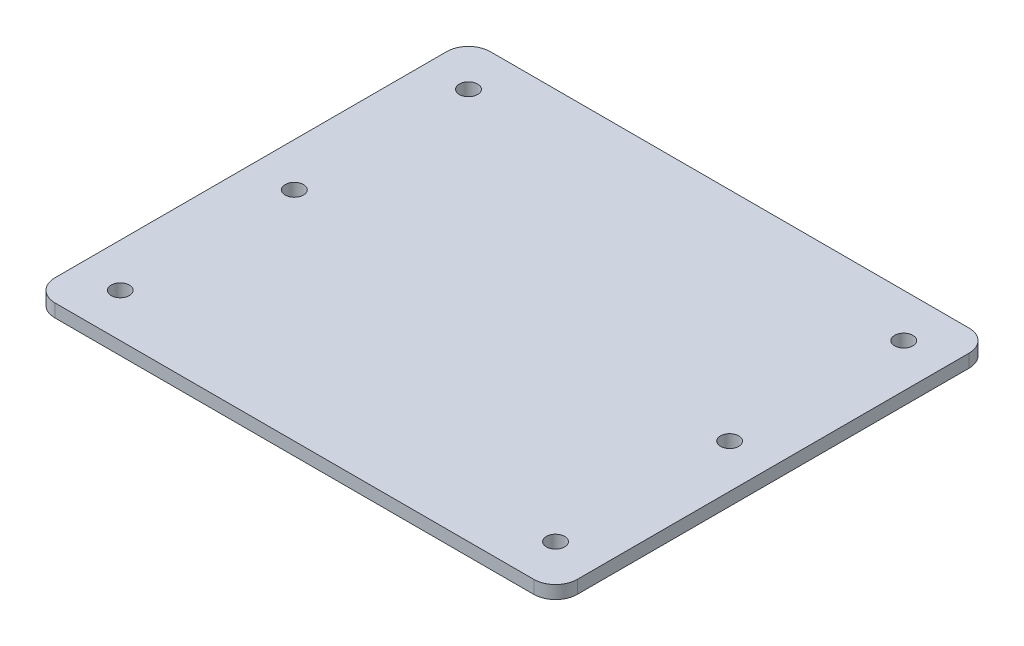
ISO-10303-21;
HEADER;
FILE_DESCRIPTION(('STEP AP214'),'2;1');
FILE_NAME('part.step','',(''),(''),'','','');
FILE_SCHEMA(('AUTOMOTIVE_DESIGN { 1 0 10303 214 1 1 1 1 }'));
ENDSEC;
DATA;
#1=APPLICATION_CONTEXT('core data for automotive mechanical design processes');
#2=APPLICATION_PROTOCOL_DEFINITION('international standard','automotive_design',2000,#1);
#3=PRODUCT_CONTEXT('',#1,'mechanical');
#4=PRODUCT('Part','Part','',(#3));
#5=PRODUCT_RELATED_PRODUCT_CATEGORY('part','',(#4));
#6=PRODUCT_DEFINITION_FORMATION('','',#4);
#7=PRODUCT_DEFINITION_CONTEXT('part definition',#1,'design');
#8=PRODUCT_DEFINITION('design','',#6,#7);
#9=PRODUCT_DEFINITION_SHAPE('','',#8);
#10=(LENGTH_UNIT() NAMED_UNIT(*) SI_UNIT(.MILLI.,.METRE.));
#11=(NAMED_UNIT(*) PLANE_ANGLE_UNIT() SI_UNIT($,.RADIAN.));
#12=(NAMED_UNIT(*) SI_UNIT($,.STERADIAN.) SOLID_ANGLE_UNIT());
#13=UNCERTAINTY_MEASURE_WITH_UNIT(LENGTH_MEASURE(1.E-05),#10,'distance_accuracy_value','');
#14=(GEOMETRIC_REPRESENTATION_CONTEXT(3) GLOBAL_UNCERTAINTY_ASSIGNED_CONTEXT((#13)) GLOBAL_UNIT_ASSIGNED_CONTEXT((#10,
#11,#12)) REPRESENTATION_CONTEXT('',''));
#15=CARTESIAN_POINT('',(0.,0.,0.));
#16=DIRECTION('',(0.,0.,1.));
#17=DIRECTION('',(1.,0.,0.));
#18=AXIS2_PLACEMENT_3D('',#15,#16,#17);
#19=CARTESIAN_POINT('',(50.,0.,40.));
#20=DIRECTION('',(0.,1.,0.));
#21=DIRECTION('',(0.,0.,1.));
#22=AXIS2_PLACEMENT_3D('',#19,#20,#21);
#23=CYLINDRICAL_SURFACE('',#22,2.1);
#24=CARTESIAN_POINT('',(50.,0.,40.));
#25=DIRECTION('',(0.,1.,0.));
#26=DIRECTION('',(0.,0.,1.));
#27=AXIS2_PLACEMENT_3D('',#24,#25,#26);
#28=CIRCLE('',#27,2.1);
#29=CARTESIAN_POINT('',(50.,0.,42.1));
#30=VERTEX_POINT('',#29);
#31=EDGE_CURVE('E42',#30,#30,#28,.T.);
#32=ORIENTED_EDGE('',*,*,#31,.F.);
#33=EDGE_LOOP('',(#32));
#34=FACE_BOUND('',#33,.T.);
#35=CARTESIAN_POINT('',(50.,3.,40.));
#36=DIRECTION('',(0.,1.,0.));
#37=DIRECTION('',(0.,0.,1.));
#38=AXIS2_PLACEMENT_3D('',#35,#36,#37);
#39=CIRCLE('',#38,2.1);
#40=CARTESIAN_POINT('',(50.,3.,42.1));
#41=VERTEX_POINT('',#40);
#42=EDGE_CURVE('E11',#41,#41,#39,.T.);
#43=ORIENTED_EDGE('',*,*,#42,.T.);
#44=EDGE_LOOP('',(#43));
#45=FACE_BOUND('',#44,.T.);
#46=ADVANCED_FACE('F35',(#34,#45),#23,.F.);
#47=CARTESIAN_POINT('',(60.,3.,-50.));
#48=DIRECTION('',(-1.,0.,0.));
#49=DIRECTION('',(0.,0.,1.));
#50=AXIS2_PLACEMENT_3D('',#47,#48,#49);
#51=PLANE('',#50);
#52=DIRECTION('',(0.,0.,-1.));
#53=VECTOR('',#52,1.);
#54=CARTESIAN_POINT('',(60.,3.,-50.));
#55=LINE('',#54,#53);
#56=CARTESIAN_POINT('',(60.,3.,45.));
#57=VERTEX_POINT('',#56);
#58=CARTESIAN_POINT('',(60.,3.,-45.));
#59=VERTEX_POINT('',#58);
#60=EDGE_CURVE('E128',#57,#59,#55,.T.);
#61=ORIENTED_EDGE('',*,*,#60,.F.);
#62=DIRECTION('',(0.,-1.,0.));
#63=VECTOR('',#62,1.);
#64=CARTESIAN_POINT('',(60.,3.,45.));
#65=LINE('',#64,#63);
#66=CARTESIAN_POINT('',(60.,0.,45.));
#67=VERTEX_POINT('',#66);
#68=EDGE_CURVE('E154',#57,#67,#65,.T.);
#69=ORIENTED_EDGE('',*,*,#68,.T.);
#70=DIRECTION('',(0.,0.,-1.));
#71=VECTOR('',#70,1.);
#72=CARTESIAN_POINT('',(60.,0.,-50.));
#73=LINE('',#72,#71);
#74=CARTESIAN_POINT('',(60.,0.,-45.));
#75=VERTEX_POINT('',#74);
#76=EDGE_CURVE('E221',#67,#75,#73,.T.);
#77=ORIENTED_EDGE('',*,*,#76,.T.);
#78=DIRECTION('',(0.,-1.,0.));
#79=VECTOR('',#78,1.);
#80=CARTESIAN_POINT('',(60.,3.,-45.));
#81=LINE('',#80,#79);
#82=EDGE_CURVE('E152',#75,#59,#81,.F.);
#83=ORIENTED_EDGE('',*,*,#82,.T.);
#84=EDGE_LOOP('',(#61,#69,#77,#83));
#85=FACE_BOUND('',#84,.T.);
#86=ADVANCED_FACE('F165',(#85),#51,.F.);
#87=CARTESIAN_POINT('',(-60.,3.,-50.));
#88=DIRECTION('',(0.,0.,1.));
#89=DIRECTION('',(1.,0.,0.));
#90=AXIS2_PLACEMENT_3D('',#87,#88,#89);
#91=PLANE('',#90);
#92=DIRECTION('',(-1.,0.,0.));
#93=VECTOR('',#92,1.);
#94=CARTESIAN_POINT('',(-60.,3.,-50.));
#95=LINE('',#94,#93);
#96=CARTESIAN_POINT('',(55.,3.,-50.));
#97=VERTEX_POINT('',#96);
#98=CARTESIAN_POINT('',(-55.,3.,-50.));
#99=VERTEX_POINT('',#98);
#100=EDGE_CURVE('E131',#97,#99,#95,.T.);
#101=ORIENTED_EDGE('',*,*,#100,.F.);
#102=DIRECTION('',(0.,-1.,0.));
#103=VECTOR('',#102,1.);
#104=CARTESIAN_POINT('',(55.,3.,-50.));
#105=LINE('',#104,#103);
#106=CARTESIAN_POINT('',(55.,0.,-50.));
#107=VERTEX_POINT('',#106);
#108=EDGE_CURVE('E158',#97,#107,#105,.T.);
#109=ORIENTED_EDGE('',*,*,#108,.T.);
#110=DIRECTION('',(-1.,0.,0.));
#111=VECTOR('',#110,1.);
#112=CARTESIAN_POINT('',(-60.,0.,-50.));
#113=LINE('',#112,#111);
#114=CARTESIAN_POINT('',(-55.,0.,-50.));
#115=VERTEX_POINT('',#114);
#116=EDGE_CURVE('E133',#107,#115,#113,.T.);
#117=ORIENTED_EDGE('',*,*,#116,.T.);
#118=DIRECTION('',(0.,-1.,0.));
#119=VECTOR('',#118,1.);
#120=CARTESIAN_POINT('',(-55.,3.,-50.));
#121=LINE('',#120,#119);
#122=EDGE_CURVE('E49',#115,#99,#121,.F.);
#123=ORIENTED_EDGE('',*,*,#122,.T.);
#124=EDGE_LOOP('',(#101,#109,#117,#123));
#125=FACE_BOUND('',#124,.T.);
#126=ADVANCED_FACE('F188',(#125),#91,.F.);
#127=CARTESIAN_POINT('',(-60.,3.,-50.));
#128=DIRECTION('',(1.,0.,0.));
#129=DIRECTION('',(0.,0.,-1.));
#130=AXIS2_PLACEMENT_3D('',#127,#128,#129);
#131=PLANE('',#130);
#132=DIRECTION('',(0.,0.,1.));
#133=VECTOR('',#132,1.);
#134=CARTESIAN_POINT('',(-60.,0.,-50.));
#135=LINE('',#134,#133);
#136=CARTESIAN_POINT('',(-60.,0.,-45.));
#137=VERTEX_POINT('',#136);
#138=CARTESIAN_POINT('',(-60.,0.,45.));
#139=VERTEX_POINT('',#138);
#140=EDGE_CURVE('E129',#137,#139,#135,.T.);
#141=ORIENTED_EDGE('',*,*,#140,.T.);
#142=DIRECTION('',(0.,-1.,0.));
#143=VECTOR('',#142,1.);
#144=CARTESIAN_POINT('',(-60.,3.,45.));
#145=LINE('',#144,#143);
#146=CARTESIAN_POINT('',(-60.,3.,45.));
#147=VERTEX_POINT('',#146);
#148=EDGE_CURVE('E106',#139,#147,#145,.F.);
#149=ORIENTED_EDGE('',*,*,#148,.T.);
#150=DIRECTION('',(0.,0.,1.));
#151=VECTOR('',#150,1.);
#152=CARTESIAN_POINT('',(-60.,3.,-50.));
#153=LINE('',#152,#151);
#154=CARTESIAN_POINT('',(-60.,3.,-45.));
#155=VERTEX_POINT('',#154);
#156=EDGE_CURVE('E216',#155,#147,#153,.T.);
#157=ORIENTED_EDGE('',*,*,#156,.F.);
#158=DIRECTION('',(0.,-1.,0.));
#159=VECTOR('',#158,1.);
#160=CARTESIAN_POINT('',(-60.,3.,-45.));
#161=LINE('',#160,#159);
#162=EDGE_CURVE('E111',#155,#137,#161,.T.);
#163=ORIENTED_EDGE('',*,*,#162,.T.);
#164=EDGE_LOOP('',(#141,#149,#157,#163));
#165=FACE_BOUND('',#164,.T.);
#166=ADVANCED_FACE('F178',(#165),#131,.F.);
#167=CARTESIAN_POINT('',(-60.,3.,50.));
#168=DIRECTION('',(0.,0.,-1.));
#169=DIRECTION('',(-1.,0.,0.));
#170=AXIS2_PLACEMENT_3D('',#167,#168,#169);
#171=PLANE('',#170);
#172=DIRECTION('',(1.,0.,0.));
#173=VECTOR('',#172,1.);
#174=CARTESIAN_POINT('',(-60.,3.,50.));
#175=LINE('',#174,#173);
#176=CARTESIAN_POINT('',(-55.,3.,50.));
#177=VERTEX_POINT('',#176);
#178=CARTESIAN_POINT('',(55.,3.,50.));
#179=VERTEX_POINT('',#178);
#180=EDGE_CURVE('E121',#177,#179,#175,.T.);
#181=ORIENTED_EDGE('',*,*,#180,.F.);
#182=DIRECTION('',(0.,-1.,0.));
#183=VECTOR('',#182,1.);
#184=CARTESIAN_POINT('',(-55.,3.,50.));
#185=LINE('',#184,#183);
#186=CARTESIAN_POINT('',(-55.,0.,50.));
#187=VERTEX_POINT('',#186);
#188=EDGE_CURVE('E105',#177,#187,#185,.T.);
#189=ORIENTED_EDGE('',*,*,#188,.T.);
#190=DIRECTION('',(1.,0.,0.));
#191=VECTOR('',#190,1.);
#192=CARTESIAN_POINT('',(-60.,0.,50.));
#193=LINE('',#192,#191);
#194=CARTESIAN_POINT('',(55.,0.,50.));
#195=VERTEX_POINT('',#194);
#196=EDGE_CURVE('E118',#187,#195,#193,.T.);
#197=ORIENTED_EDGE('',*,*,#196,.T.);
#198=DIRECTION('',(0.,-1.,0.));
#199=VECTOR('',#198,1.);
#200=CARTESIAN_POINT('',(55.,3.,50.));
#201=LINE('',#200,#199);
#202=EDGE_CURVE('E123',#195,#179,#201,.F.);
#203=ORIENTED_EDGE('',*,*,#202,.T.);
#204=EDGE_LOOP('',(#181,#189,#197,#203));
#205=FACE_BOUND('',#204,.T.);
#206=ADVANCED_FACE('F117',(#205),#171,.F.);
#207=CARTESIAN_POINT('',(0.,3.,0.));
#208=DIRECTION('',(0.,1.,0.));
#209=DIRECTION('',(0.,0.,1.));
#210=AXIS2_PLACEMENT_3D('',#207,#208,#209);
#211=PLANE('',#210);
#212=CARTESIAN_POINT('',(-50.,3.,-40.));
#213=DIRECTION('',(0.,-1.,0.));
#214=DIRECTION('',(0.,0.,1.));
#215=AXIS2_PLACEMENT_3D('',#212,#213,#214);
#216=CIRCLE('',#215,2.1);
#217=CARTESIAN_POINT('',(-50.,3.,-37.9));
#218=VERTEX_POINT('',#217);
#219=EDGE_CURVE('E257',#218,#218,#216,.T.);
#220=ORIENTED_EDGE('',*,*,#219,.T.);
#221=EDGE_LOOP('',(#220));
#222=FACE_BOUND('',#221,.T.);
#223=CARTESIAN_POINT('',(-50.,3.,0.));
#224=DIRECTION('',(0.,-1.,0.));
#225=DIRECTION('',(0.,0.,1.));
#226=AXIS2_PLACEMENT_3D('',#223,#224,#225);
#227=CIRCLE('',#226,2.1);
#228=CARTESIAN_POINT('',(-50.,3.,2.10000000000001));
#229=VERTEX_POINT('',#228);
#230=EDGE_CURVE('E251',#229,#229,#227,.T.);
#231=ORIENTED_EDGE('',*,*,#230,.T.);
#232=EDGE_LOOP('',(#231));
#233=FACE_BOUND('',#232,.T.);
#234=CARTESIAN_POINT('',(-50.,3.,40.));
#235=DIRECTION('',(0.,-1.,0.));
#236=DIRECTION('',(0.,0.,1.));
#237=AXIS2_PLACEMENT_3D('',#234,#235,#236);
#238=CIRCLE('',#237,2.1);
#239=CARTESIAN_POINT('',(-50.,3.,42.1));
#240=VERTEX_POINT('',#239);
#241=EDGE_CURVE('E245',#240,#240,#238,.T.);
#242=ORIENTED_EDGE('',*,*,#241,.T.);
#243=EDGE_LOOP('',(#242));
#244=FACE_BOUND('',#243,.T.);
#245=CARTESIAN_POINT('',(50.,3.,0.));
#246=DIRECTION('',(0.,1.,0.));
#247=DIRECTION('',(0.,0.,1.));
#248=AXIS2_PLACEMENT_3D('',#245,#246,#247);
#249=CIRCLE('',#248,2.1);
#250=CARTESIAN_POINT('',(50.,3.,2.1));
#251=VERTEX_POINT('',#250);
#252=EDGE_CURVE('E236',#251,#251,#249,.T.);
#253=ORIENTED_EDGE('',*,*,#252,.F.);
#254=EDGE_LOOP('',(#253));
#255=FACE_BOUND('',#254,.T.);
#256=CARTESIAN_POINT('',(50.,3.,-40.));
#257=DIRECTION('',(0.,1.,0.));
#258=DIRECTION('',(0.,0.,1.));
#259=AXIS2_PLACEMENT_3D('',#256,#257,#258);
#260=CIRCLE('',#259,2.1);
#261=CARTESIAN_POINT('',(50.,3.,-37.9));
#262=VERTEX_POINT('',#261);
#263=EDGE_CURVE('E231',#262,#262,#260,.T.);
#264=ORIENTED_EDGE('',*,*,#263,.F.);
#265=EDGE_LOOP('',(#264));
#266=FACE_BOUND('',#265,.T.);
#267=ORIENTED_EDGE('',*,*,#156,.T.);
#268=CARTESIAN_POINT('',(-55.,3.,45.));
#269=DIRECTION('',(0.,1.,0.));
#270=DIRECTION('',(0.,0.,1.));
#271=AXIS2_PLACEMENT_3D('',#268,#269,#270);
#272=CIRCLE('',#271,5.);
#273=EDGE_CURVE('E150',#147,#177,#272,.T.);
#274=ORIENTED_EDGE('',*,*,#273,.T.);
#275=ORIENTED_EDGE('',*,*,#180,.T.);
#276=CARTESIAN_POINT('',(55.,3.,45.));
#277=DIRECTION('',(0.,1.,0.));
#278=DIRECTION('',(0.,0.,1.));
#279=AXIS2_PLACEMENT_3D('',#276,#277,#278);
#280=CIRCLE('',#279,5.);
#281=EDGE_CURVE('E148',#179,#57,#280,.T.);
#282=ORIENTED_EDGE('',*,*,#281,.T.);
#283=ORIENTED_EDGE('',*,*,#60,.T.);
#284=CARTESIAN_POINT('',(55.,3.,-45.));
#285=DIRECTION('',(0.,1.,0.));
#286=DIRECTION('',(0.,0.,1.));
#287=AXIS2_PLACEMENT_3D('',#284,#285,#286);
#288=CIRCLE('',#287,5.);
#289=EDGE_CURVE('E56',#59,#97,#288,.T.);
#290=ORIENTED_EDGE('',*,*,#289,.T.);
#291=ORIENTED_EDGE('',*,*,#100,.T.);
#292=CARTESIAN_POINT('',(-55.,3.,-45.));
#293=DIRECTION('',(0.,1.,0.));
#294=DIRECTION('',(0.,0.,1.));
#295=AXIS2_PLACEMENT_3D('',#292,#293,#294);
#296=CIRCLE('',#295,5.);
#297=EDGE_CURVE('E145',#99,#155,#296,.T.);
#298=ORIENTED_EDGE('',*,*,#297,.T.);
#299=EDGE_LOOP('',(#267,#274,#275,#282,#283,#290,#291,#298));
#300=FACE_BOUND('',#299,.T.);
#301=ORIENTED_EDGE('',*,*,#42,.F.);
#302=EDGE_LOOP('',(#301));
#303=FACE_BOUND('',#302,.T.);
#304=ADVANCED_FACE('F168',(#222,#233,#244,#255,#266,#300,#303),#211,.T.);
#305=CARTESIAN_POINT('',(0.,0.,0.));
#306=DIRECTION('',(0.,1.,0.));
#307=DIRECTION('',(0.,0.,1.));
#308=AXIS2_PLACEMENT_3D('',#305,#306,#307);
#309=PLANE('',#308);
#310=CARTESIAN_POINT('',(-50.,0.,-40.));
#311=DIRECTION('',(0.,-1.,0.));
#312=DIRECTION('',(0.,0.,1.));
#313=AXIS2_PLACEMENT_3D('',#310,#311,#312);
#314=CIRCLE('',#313,2.1);
#315=CARTESIAN_POINT('',(-50.,0.,-37.9));
#316=VERTEX_POINT('',#315);
#317=EDGE_CURVE('E244',#316,#316,#314,.T.);
#318=ORIENTED_EDGE('',*,*,#317,.F.);
#319=EDGE_LOOP('',(#318));
#320=FACE_BOUND('',#319,.T.);
#321=CARTESIAN_POINT('',(-50.,0.,0.));
#322=DIRECTION('',(0.,-1.,0.));
#323=DIRECTION('',(0.,0.,1.));
#324=AXIS2_PLACEMENT_3D('',#321,#322,#323);
#325=CIRCLE('',#324,2.1);
#326=CARTESIAN_POINT('',(-50.,0.,2.10000000000001));
#327=VERTEX_POINT('',#326);
#328=EDGE_CURVE('E254',#327,#327,#325,.T.);
#329=ORIENTED_EDGE('',*,*,#328,.F.);
#330=EDGE_LOOP('',(#329));
#331=FACE_BOUND('',#330,.T.);
#332=CARTESIAN_POINT('',(-50.,0.,40.));
#333=DIRECTION('',(0.,-1.,0.));
#334=DIRECTION('',(0.,0.,1.));
#335=AXIS2_PLACEMENT_3D('',#332,#333,#334);
#336=CIRCLE('',#335,2.1);
#337=CARTESIAN_POINT('',(-50.,0.,42.1));
#338=VERTEX_POINT('',#337);
#339=EDGE_CURVE('E248',#338,#338,#336,.T.);
#340=ORIENTED_EDGE('',*,*,#339,.F.);
#341=EDGE_LOOP('',(#340));
#342=FACE_BOUND('',#341,.T.);
#343=CARTESIAN_POINT('',(50.,0.,0.));
#344=DIRECTION('',(0.,1.,0.));
#345=DIRECTION('',(0.,0.,1.));
#346=AXIS2_PLACEMENT_3D('',#343,#344,#345);
#347=CIRCLE('',#346,2.1);
#348=CARTESIAN_POINT('',(50.,0.,2.1));
#349=VERTEX_POINT('',#348);
#350=EDGE_CURVE('E241',#349,#349,#347,.T.);
#351=ORIENTED_EDGE('',*,*,#350,.T.);
#352=EDGE_LOOP('',(#351));
#353=FACE_BOUND('',#352,.T.);
#354=CARTESIAN_POINT('',(50.,0.,-40.));
#355=DIRECTION('',(0.,1.,0.));
#356=DIRECTION('',(0.,0.,1.));
#357=AXIS2_PLACEMENT_3D('',#354,#355,#356);
#358=CIRCLE('',#357,2.1);
#359=CARTESIAN_POINT('',(50.,0.,-37.9));
#360=VERTEX_POINT('',#359);
#361=EDGE_CURVE('E223',#360,#360,#358,.T.);
#362=ORIENTED_EDGE('',*,*,#361,.T.);
#363=EDGE_LOOP('',(#362));
#364=FACE_BOUND('',#363,.T.);
#365=ORIENTED_EDGE('',*,*,#196,.F.);
#366=CARTESIAN_POINT('',(-55.,0.,45.));
#367=DIRECTION('',(0.,1.,0.));
#368=DIRECTION('',(0.,0.,1.));
#369=AXIS2_PLACEMENT_3D('',#366,#367,#368);
#370=CIRCLE('',#369,5.);
#371=EDGE_CURVE('E101',#187,#139,#370,.F.);
#372=ORIENTED_EDGE('',*,*,#371,.T.);
#373=ORIENTED_EDGE('',*,*,#140,.F.);
#374=CARTESIAN_POINT('',(-55.,0.,-45.));
#375=DIRECTION('',(0.,1.,0.));
#376=DIRECTION('',(0.,0.,1.));
#377=AXIS2_PLACEMENT_3D('',#374,#375,#376);
#378=CIRCLE('',#377,5.);
#379=EDGE_CURVE('E122',#137,#115,#378,.F.);
#380=ORIENTED_EDGE('',*,*,#379,.T.);
#381=ORIENTED_EDGE('',*,*,#116,.F.);
#382=CARTESIAN_POINT('',(55.,0.,-45.));
#383=DIRECTION('',(0.,1.,0.));
#384=DIRECTION('',(0.,0.,1.));
#385=AXIS2_PLACEMENT_3D('',#382,#383,#384);
#386=CIRCLE('',#385,5.);
#387=EDGE_CURVE('E139',#107,#75,#386,.F.);
#388=ORIENTED_EDGE('',*,*,#387,.T.);
#389=ORIENTED_EDGE('',*,*,#76,.F.);
#390=CARTESIAN_POINT('',(55.,0.,45.));
#391=DIRECTION('',(0.,1.,0.));
#392=DIRECTION('',(0.,0.,1.));
#393=AXIS2_PLACEMENT_3D('',#390,#391,#392);
#394=CIRCLE('',#393,5.);
#395=EDGE_CURVE('E112',#67,#195,#394,.F.);
#396=ORIENTED_EDGE('',*,*,#395,.T.);
#397=EDGE_LOOP('',(#365,#372,#373,#380,#381,#388,#389,#396));
#398=FACE_BOUND('',#397,.T.);
#399=ORIENTED_EDGE('',*,*,#31,.T.);
#400=EDGE_LOOP('',(#399));
#401=FACE_BOUND('',#400,.T.);
#402=ADVANCED_FACE('F125',(#320,#331,#342,#353,#364,#398,#401),#309,.F.);
#403=CARTESIAN_POINT('',(-55.,3.,45.));
#404=DIRECTION('',(0.,-1.,0.));
#405=DIRECTION('',(0.,0.,-1.));
#406=AXIS2_PLACEMENT_3D('',#403,#404,#405);
#407=CYLINDRICAL_SURFACE('',#406,5.);
#408=ORIENTED_EDGE('',*,*,#273,.F.);
#409=ORIENTED_EDGE('',*,*,#148,.F.);
#410=ORIENTED_EDGE('',*,*,#371,.F.);
#411=ORIENTED_EDGE('',*,*,#188,.F.);
#412=EDGE_LOOP('',(#408,#409,#410,#411));
#413=FACE_BOUND('',#412,.T.);
#414=ADVANCED_FACE('F104',(#413),#407,.T.);
#415=CARTESIAN_POINT('',(55.,3.,45.));
#416=DIRECTION('',(0.,-1.,0.));
#417=DIRECTION('',(0.,0.,-1.));
#418=AXIS2_PLACEMENT_3D('',#415,#416,#417);
#419=CYLINDRICAL_SURFACE('',#418,5.);
#420=ORIENTED_EDGE('',*,*,#281,.F.);
#421=ORIENTED_EDGE('',*,*,#202,.F.);
#422=ORIENTED_EDGE('',*,*,#395,.F.);
#423=ORIENTED_EDGE('',*,*,#68,.F.);
#424=EDGE_LOOP('',(#420,#421,#422,#423));
#425=FACE_BOUND('',#424,.T.);
#426=ADVANCED_FACE('F197',(#425),#419,.T.);
#427=CARTESIAN_POINT('',(55.,3.,-45.));
#428=DIRECTION('',(0.,-1.,0.));
#429=DIRECTION('',(0.,0.,-1.));
#430=AXIS2_PLACEMENT_3D('',#427,#428,#429);
#431=CYLINDRICAL_SURFACE('',#430,5.);
#432=ORIENTED_EDGE('',*,*,#289,.F.);
#433=ORIENTED_EDGE('',*,*,#82,.F.);
#434=ORIENTED_EDGE('',*,*,#387,.F.);
#435=ORIENTED_EDGE('',*,*,#108,.F.);
#436=EDGE_LOOP('',(#432,#433,#434,#435));
#437=FACE_BOUND('',#436,.T.);
#438=ADVANCED_FACE('F200',(#437),#431,.T.);
#439=CARTESIAN_POINT('',(-55.,3.,-45.));
#440=DIRECTION('',(0.,-1.,0.));
#441=DIRECTION('',(0.,0.,-1.));
#442=AXIS2_PLACEMENT_3D('',#439,#440,#441);
#443=CYLINDRICAL_SURFACE('',#442,5.);
#444=ORIENTED_EDGE('',*,*,#297,.F.);
#445=ORIENTED_EDGE('',*,*,#122,.F.);
#446=ORIENTED_EDGE('',*,*,#379,.F.);
#447=ORIENTED_EDGE('',*,*,#162,.F.);
#448=EDGE_LOOP('',(#444,#445,#446,#447));
#449=FACE_BOUND('',#448,.T.);
#450=ADVANCED_FACE('F203',(#449),#443,.T.);
#451=CARTESIAN_POINT('',(50.,0.,-40.));
#452=DIRECTION('',(0.,1.,0.));
#453=DIRECTION('',(0.,0.,1.));
#454=AXIS2_PLACEMENT_3D('',#451,#452,#453);
#455=CYLINDRICAL_SURFACE('',#454,2.1);
#456=ORIENTED_EDGE('',*,*,#361,.F.);
#457=EDGE_LOOP('',(#456));
#458=FACE_BOUND('',#457,.T.);
#459=ORIENTED_EDGE('',*,*,#263,.T.);
#460=EDGE_LOOP('',(#459));
#461=FACE_BOUND('',#460,.T.);
#462=ADVANCED_FACE('F183',(#458,#461),#455,.F.);
#463=CARTESIAN_POINT('',(50.,0.,0.));
#464=DIRECTION('',(0.,1.,0.));
#465=DIRECTION('',(0.,0.,1.));
#466=AXIS2_PLACEMENT_3D('',#463,#464,#465);
#467=CYLINDRICAL_SURFACE('',#466,2.1);
#468=ORIENTED_EDGE('',*,*,#350,.F.);
#469=EDGE_LOOP('',(#468));
#470=FACE_BOUND('',#469,.T.);
#471=ORIENTED_EDGE('',*,*,#252,.T.);
#472=EDGE_LOOP('',(#471));
#473=FACE_BOUND('',#472,.T.);
#474=ADVANCED_FACE('F210',(#470,#473),#467,.F.);
#475=CARTESIAN_POINT('',(-50.,0.,40.));
#476=DIRECTION('',(0.,1.,0.));
#477=DIRECTION('',(0.,0.,1.));
#478=AXIS2_PLACEMENT_3D('',#475,#476,#477);
#479=CYLINDRICAL_SURFACE('',#478,2.1);
#480=ORIENTED_EDGE('',*,*,#339,.T.);
#481=EDGE_LOOP('',(#480));
#482=FACE_BOUND('',#481,.T.);
#483=ORIENTED_EDGE('',*,*,#241,.F.);
#484=EDGE_LOOP('',(#483));
#485=FACE_BOUND('',#484,.T.);
#486=ADVANCED_FACE('F273',(#482,#485),#479,.F.);
#487=CARTESIAN_POINT('',(-50.,0.,0.));
#488=DIRECTION('',(0.,1.,0.));
#489=DIRECTION('',(0.,0.,1.));
#490=AXIS2_PLACEMENT_3D('',#487,#488,#489);
#491=CYLINDRICAL_SURFACE('',#490,2.1);
#492=ORIENTED_EDGE('',*,*,#328,.T.);
#493=EDGE_LOOP('',(#492));
#494=FACE_BOUND('',#493,.T.);
#495=ORIENTED_EDGE('',*,*,#230,.F.);
#496=EDGE_LOOP('',(#495));
#497=FACE_BOUND('',#496,.T.);
#498=ADVANCED_FACE('F282',(#494,#497),#491,.F.);
#499=CARTESIAN_POINT('',(-50.,0.,-40.));
#500=DIRECTION('',(0.,1.,0.));
#501=DIRECTION('',(0.,0.,1.));
#502=AXIS2_PLACEMENT_3D('',#499,#500,#501);
#503=CYLINDRICAL_SURFACE('',#502,2.1);
#504=ORIENTED_EDGE('',*,*,#317,.T.);
#505=EDGE_LOOP('',(#504));
#506=FACE_BOUND('',#505,.T.);
#507=ORIENTED_EDGE('',*,*,#219,.F.);
#508=EDGE_LOOP('',(#507));
#509=FACE_BOUND('',#508,.T.);
#510=ADVANCED_FACE('F262',(#506,#509),#503,.F.);
#511=CLOSED_SHELL('',(#46,#86,#126,#166,#206,#304,#402,#414,#426,#438,#450,#462,#474,#486,#498,#510));
#512=MANIFOLD_SOLID_BREP('B2',#511);
#513=ADVANCED_BREP_SHAPE_REPRESENTATION('',(#18,#512),#14);
#514=SHAPE_DEFINITION_REPRESENTATION(#9,#513);
ENDSEC;
END-ISO-10303-21;
